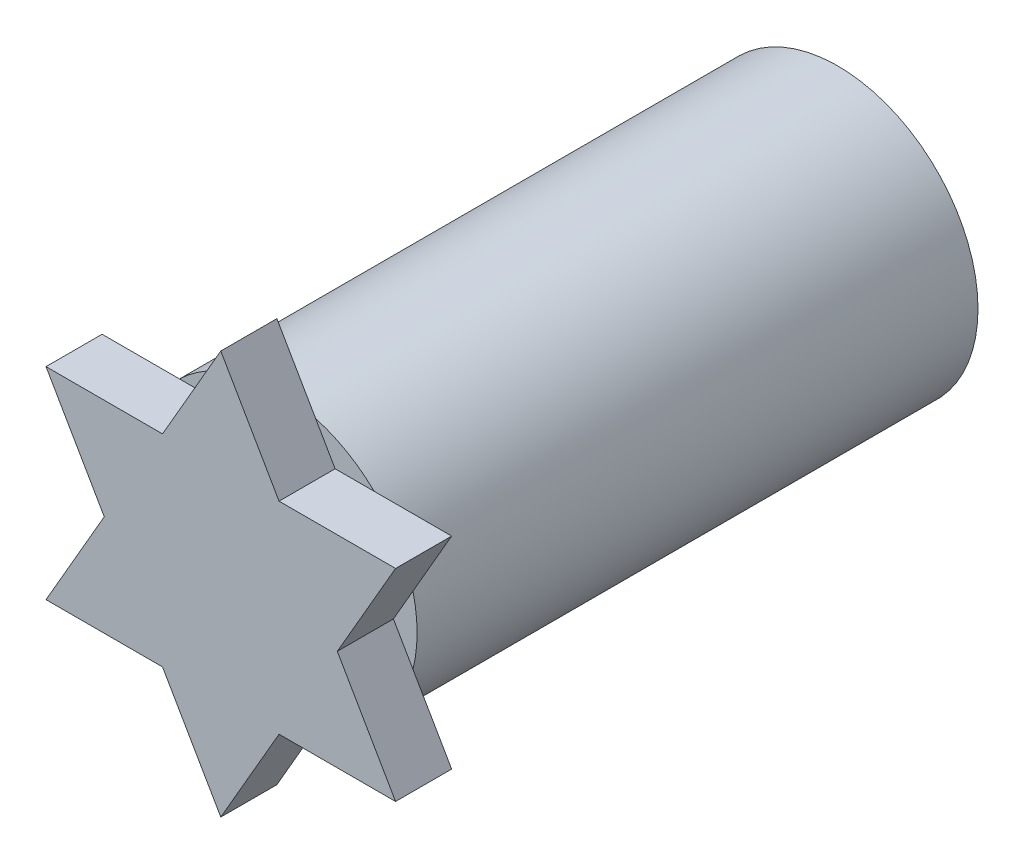
ISO-10303-21;
HEADER;
FILE_DESCRIPTION(('STEP AP214'),'2;1');
FILE_NAME('part.step','',(''),(''),'','','');
FILE_SCHEMA(('AUTOMOTIVE_DESIGN { 1 0 10303 214 1 1 1 1 }'));
ENDSEC;
DATA;
#1=APPLICATION_CONTEXT('core data for automotive mechanical design processes');
#2=APPLICATION_PROTOCOL_DEFINITION('international standard','automotive_design',2000,#1);
#3=PRODUCT_CONTEXT('',#1,'mechanical');
#4=PRODUCT('Part','Part','',(#3));
#5=PRODUCT_RELATED_PRODUCT_CATEGORY('part','',(#4));
#6=PRODUCT_DEFINITION_FORMATION('','',#4);
#7=PRODUCT_DEFINITION_CONTEXT('part definition',#1,'design');
#8=PRODUCT_DEFINITION('design','',#6,#7);
#9=PRODUCT_DEFINITION_SHAPE('','',#8);
#10=(LENGTH_UNIT() NAMED_UNIT(*) SI_UNIT(.MILLI.,.METRE.));
#11=(NAMED_UNIT(*) PLANE_ANGLE_UNIT() SI_UNIT($,.RADIAN.));
#12=(NAMED_UNIT(*) SI_UNIT($,.STERADIAN.) SOLID_ANGLE_UNIT());
#13=UNCERTAINTY_MEASURE_WITH_UNIT(LENGTH_MEASURE(1.E-05),#10,'distance_accuracy_value','');
#14=(GEOMETRIC_REPRESENTATION_CONTEXT(3) GLOBAL_UNCERTAINTY_ASSIGNED_CONTEXT((#13)) GLOBAL_UNIT_ASSIGNED_CONTEXT((#10,
#11,#12)) REPRESENTATION_CONTEXT('',''));
#15=CARTESIAN_POINT('',(0.,0.,0.));
#16=DIRECTION('',(0.,0.,1.));
#17=DIRECTION('',(1.,0.,0.));
#18=AXIS2_PLACEMENT_3D('',#15,#16,#17);
#19=CARTESIAN_POINT('',(0.,0.,10.));
#20=DIRECTION('',(0.,0.,1.));
#21=DIRECTION('',(1.,0.,0.));
#22=AXIS2_PLACEMENT_3D('',#19,#20,#21);
#23=PLANE('',#22);
#24=DIRECTION('',(-1.,0.,0.));
#25=VECTOR('',#24,1.);
#26=CARTESIAN_POINT('',(0.,1.799083866182,10.));
#27=LINE('',#26,#25);
#28=CARTESIAN_POINT('',(-1.03870155443489,1.799083866182,10.));
#29=VERTEX_POINT('',#28);
#30=CARTESIAN_POINT('',(-1.73588514667406,1.799083866182,10.));
#31=VERTEX_POINT('',#30);
#32=EDGE_CURVE('E60',#29,#31,#27,.T.);
#33=ORIENTED_EDGE('',*,*,#32,.F.);
#34=DIRECTION('',(-0.5,-0.866025403784439,0.));
#35=VECTOR('',#34,1.);
#36=CARTESIAN_POINT('',(-1.55805233165234,0.899541933091002,10.));
#37=LINE('',#36,#35);
#38=CARTESIAN_POINT('',(-0.690109758315309,2.40286256816281,10.));
#39=VERTEX_POINT('',#38);
#40=EDGE_CURVE('E11',#39,#29,#37,.T.);
#41=ORIENTED_EDGE('',*,*,#40,.F.);
#42=CARTESIAN_POINT('',(0.,0.,10.));
#43=DIRECTION('',(0.,0.,1.));
#44=DIRECTION('',(1.,0.,0.));
#45=AXIS2_PLACEMENT_3D('',#42,#43,#44);
#46=CIRCLE('',#45,2.5);
#47=EDGE_CURVE('E266',#39,#31,#46,.T.);
#48=ORIENTED_EDGE('',*,*,#47,.T.);
#49=EDGE_LOOP('',(#33,#41,#48));
#50=FACE_BOUND('',#49,.T.);
#51=ADVANCED_FACE('F41',(#50),#23,.T.);
#52=DIRECTION('',(-0.5,0.866025403784438,0.));
#53=VECTOR('',#52,1.);
#54=CARTESIAN_POINT('',(1.55805233165234,0.899541933091003,10.));
#55=LINE('',#54,#53);
#56=CARTESIAN_POINT('',(1.03870155443489,1.799083866182,10.));
#57=VERTEX_POINT('',#56);
#58=CARTESIAN_POINT('',(0.69010975831531,2.40286256816281,10.));
#59=VERTEX_POINT('',#58);
#60=EDGE_CURVE('E67',#57,#59,#55,.T.);
#61=ORIENTED_EDGE('',*,*,#60,.F.);
#62=DIRECTION('',(-1.,0.,0.));
#63=VECTOR('',#62,1.);
#64=CARTESIAN_POINT('',(0.,1.799083866182,10.));
#65=LINE('',#64,#63);
#66=CARTESIAN_POINT('',(1.73588514667406,1.799083866182,10.));
#67=VERTEX_POINT('',#66);
#68=EDGE_CURVE('E51',#67,#57,#65,.T.);
#69=ORIENTED_EDGE('',*,*,#68,.F.);
#70=EDGE_CURVE('E212',#67,#59,#46,.T.);
#71=ORIENTED_EDGE('',*,*,#70,.T.);
#72=EDGE_LOOP('',(#61,#69,#71));
#73=FACE_BOUND('',#72,.T.);
#74=ADVANCED_FACE('F401',(#73),#23,.T.);
#75=DIRECTION('',(0.5,0.866025403784439,0.));
#76=VECTOR('',#75,1.);
#77=CARTESIAN_POINT('',(1.55805233165234,-0.899541933091001,10.));
#78=LINE('',#77,#76);
#79=CARTESIAN_POINT('',(2.07740310886979,0.,10.));
#80=VERTEX_POINT('',#79);
#81=CARTESIAN_POINT('',(2.42599490498937,0.603778701980809,10.));
#82=VERTEX_POINT('',#81);
#83=EDGE_CURVE('E378',#80,#82,#78,.T.);
#84=ORIENTED_EDGE('',*,*,#83,.F.);
#85=DIRECTION('',(-0.5,0.866025403784438,0.));
#86=VECTOR('',#85,1.);
#87=CARTESIAN_POINT('',(1.55805233165234,0.899541933091003,10.));
#88=LINE('',#87,#86);
#89=CARTESIAN_POINT('',(2.42599490498937,-0.603778701980807,10.));
#90=VERTEX_POINT('',#89);
#91=EDGE_CURVE('E349',#90,#80,#88,.T.);
#92=ORIENTED_EDGE('',*,*,#91,.F.);
#93=EDGE_CURVE('E204',#90,#82,#46,.T.);
#94=ORIENTED_EDGE('',*,*,#93,.T.);
#95=EDGE_LOOP('',(#84,#92,#94));
#96=FACE_BOUND('',#95,.T.);
#97=ADVANCED_FACE('F394',(#96),#23,.T.);
#98=DIRECTION('',(1.,0.,0.));
#99=VECTOR('',#98,1.);
#100=CARTESIAN_POINT('',(0.,-1.799083866182,10.));
#101=LINE('',#100,#99);
#102=CARTESIAN_POINT('',(1.03870155443489,-1.799083866182,10.));
#103=VERTEX_POINT('',#102);
#104=CARTESIAN_POINT('',(1.73588514667406,-1.799083866182,10.));
#105=VERTEX_POINT('',#104);
#106=EDGE_CURVE('E363',#103,#105,#101,.T.);
#107=ORIENTED_EDGE('',*,*,#106,.F.);
#108=DIRECTION('',(0.5,0.866025403784439,0.));
#109=VECTOR('',#108,1.);
#110=CARTESIAN_POINT('',(1.55805233165234,-0.899541933091001,10.));
#111=LINE('',#110,#109);
#112=CARTESIAN_POINT('',(0.69010975831531,-2.40286256816281,10.));
#113=VERTEX_POINT('',#112);
#114=EDGE_CURVE('E346',#113,#103,#111,.T.);
#115=ORIENTED_EDGE('',*,*,#114,.F.);
#116=EDGE_CURVE('E230',#113,#105,#46,.T.);
#117=ORIENTED_EDGE('',*,*,#116,.T.);
#118=EDGE_LOOP('',(#107,#115,#117));
#119=FACE_BOUND('',#118,.T.);
#120=ADVANCED_FACE('F392',(#119),#23,.T.);
#121=DIRECTION('',(0.5,-0.866025403784439,0.));
#122=VECTOR('',#121,1.);
#123=CARTESIAN_POINT('',(-1.55805233165234,-0.899541933091001,10.));
#124=LINE('',#123,#122);
#125=CARTESIAN_POINT('',(-1.03870155443489,-1.799083866182,10.));
#126=VERTEX_POINT('',#125);
#127=CARTESIAN_POINT('',(-0.69010975831531,-2.40286256816281,10.));
#128=VERTEX_POINT('',#127);
#129=EDGE_CURVE('E342',#126,#128,#124,.T.);
#130=ORIENTED_EDGE('',*,*,#129,.F.);
#131=DIRECTION('',(1.,0.,0.));
#132=VECTOR('',#131,1.);
#133=CARTESIAN_POINT('',(0.,-1.799083866182,10.));
#134=LINE('',#133,#132);
#135=CARTESIAN_POINT('',(-1.73588514667406,-1.799083866182,10.));
#136=VERTEX_POINT('',#135);
#137=EDGE_CURVE('E220',#136,#126,#134,.T.);
#138=ORIENTED_EDGE('',*,*,#137,.F.);
#139=EDGE_CURVE('E242',#136,#128,#46,.T.);
#140=ORIENTED_EDGE('',*,*,#139,.T.);
#141=EDGE_LOOP('',(#130,#138,#140));
#142=FACE_BOUND('',#141,.T.);
#143=ADVANCED_FACE('F369',(#142),#23,.T.);
#144=CARTESIAN_POINT('',(0.,0.,10.));
#145=DIRECTION('',(0.,0.,-1.));
#146=DIRECTION('',(-1.,0.,0.));
#147=AXIS2_PLACEMENT_3D('',#144,#145,#146);
#148=CYLINDRICAL_SURFACE('',#147,2.5);
#149=EDGE_CURVE('E208',#82,#67,#46,.T.);
#150=ORIENTED_EDGE('',*,*,#149,.F.);
#151=ORIENTED_EDGE('',*,*,#93,.F.);
#152=EDGE_CURVE('E225',#105,#90,#46,.T.);
#153=ORIENTED_EDGE('',*,*,#152,.F.);
#154=ORIENTED_EDGE('',*,*,#116,.F.);
#155=EDGE_CURVE('E237',#128,#113,#46,.T.);
#156=ORIENTED_EDGE('',*,*,#155,.F.);
#157=ORIENTED_EDGE('',*,*,#139,.F.);
#158=CARTESIAN_POINT('',(-2.42599490498937,-0.603778701980808,10.));
#159=VERTEX_POINT('',#158);
#160=EDGE_CURVE('E249',#159,#136,#46,.T.);
#161=ORIENTED_EDGE('',*,*,#160,.F.);
#162=CARTESIAN_POINT('',(-2.42599490498937,0.603778701980809,10.));
#163=VERTEX_POINT('',#162);
#164=EDGE_CURVE('E254',#163,#159,#46,.T.);
#165=ORIENTED_EDGE('',*,*,#164,.F.);
#166=EDGE_CURVE('E261',#31,#163,#46,.T.);
#167=ORIENTED_EDGE('',*,*,#166,.F.);
#168=ORIENTED_EDGE('',*,*,#47,.F.);
#169=EDGE_CURVE('E223',#59,#39,#46,.T.);
#170=ORIENTED_EDGE('',*,*,#169,.F.);
#171=ORIENTED_EDGE('',*,*,#70,.F.);
#172=EDGE_LOOP('',(#150,#151,#153,#154,#156,#157,#161,#165,#167,#168,#170,#171));
#173=FACE_BOUND('',#172,.T.);
#174=CARTESIAN_POINT('',(0.,0.,0.));
#175=DIRECTION('',(0.,0.,1.));
#176=DIRECTION('',(1.,0.,0.));
#177=AXIS2_PLACEMENT_3D('',#174,#175,#176);
#178=CIRCLE('',#177,2.5);
#179=CARTESIAN_POINT('',(2.5,0.,0.));
#180=VERTEX_POINT('',#179);
#181=EDGE_CURVE('E45',#180,#180,#178,.T.);
#182=ORIENTED_EDGE('',*,*,#181,.T.);
#183=EDGE_LOOP('',(#182));
#184=FACE_BOUND('',#183,.T.);
#185=ADVANCED_FACE('F43',(#173,#184),#148,.T.);
#186=DIRECTION('',(-0.5,-0.866025403784439,0.));
#187=VECTOR('',#186,1.);
#188=CARTESIAN_POINT('',(-1.55805233165234,0.899541933091002,10.));
#189=LINE('',#188,#187);
#190=CARTESIAN_POINT('',(-2.07740310886978,0.,10.));
#191=VERTEX_POINT('',#190);
#192=EDGE_CURVE('E338',#191,#159,#189,.T.);
#193=ORIENTED_EDGE('',*,*,#192,.F.);
#194=DIRECTION('',(0.5,-0.866025403784439,0.));
#195=VECTOR('',#194,1.);
#196=CARTESIAN_POINT('',(-1.55805233165234,-0.899541933091001,10.));
#197=LINE('',#196,#195);
#198=EDGE_CURVE('E211',#163,#191,#197,.T.);
#199=ORIENTED_EDGE('',*,*,#198,.F.);
#200=ORIENTED_EDGE('',*,*,#164,.T.);
#201=EDGE_LOOP('',(#193,#199,#200));
#202=FACE_BOUND('',#201,.T.);
#203=ADVANCED_FACE('F400',(#202),#23,.T.);
#204=CARTESIAN_POINT('',(0.,0.,0.));
#205=DIRECTION('',(0.,0.,1.));
#206=DIRECTION('',(1.,0.,0.));
#207=AXIS2_PLACEMENT_3D('',#204,#205,#206);
#208=PLANE('',#207);
#209=ORIENTED_EDGE('',*,*,#181,.F.);
#210=EDGE_LOOP('',(#209));
#211=FACE_BOUND('',#210,.T.);
#212=ADVANCED_FACE('F408',(#211),#208,.F.);
#213=CARTESIAN_POINT('',(0.,0.,10.));
#214=DIRECTION('',(0.,0.,1.));
#215=DIRECTION('',(1.,0.,0.));
#216=AXIS2_PLACEMENT_3D('',#213,#214,#215);
#217=PLANE('',#216);
#218=CARTESIAN_POINT('',(3.11610466330468,1.799083866182,10.));
#219=VERTEX_POINT('',#218);
#220=EDGE_CURVE('E371',#82,#219,#78,.T.);
#221=ORIENTED_EDGE('',*,*,#220,.F.);
#222=ORIENTED_EDGE('',*,*,#149,.T.);
#223=EDGE_CURVE('E374',#219,#67,#65,.T.);
#224=ORIENTED_EDGE('',*,*,#223,.F.);
#225=EDGE_LOOP('',(#221,#222,#224));
#226=FACE_BOUND('',#225,.T.);
#227=ADVANCED_FACE('F373',(#226),#217,.F.);
#228=CARTESIAN_POINT('',(0.,3.598167732364,10.));
#229=VERTEX_POINT('',#228);
#230=EDGE_CURVE('E277',#59,#229,#55,.T.);
#231=ORIENTED_EDGE('',*,*,#230,.F.);
#232=ORIENTED_EDGE('',*,*,#169,.T.);
#233=EDGE_CURVE('E53',#229,#39,#37,.T.);
#234=ORIENTED_EDGE('',*,*,#233,.F.);
#235=EDGE_LOOP('',(#231,#232,#234));
#236=FACE_BOUND('',#235,.T.);
#237=ADVANCED_FACE('F276',(#236),#217,.F.);
#238=CARTESIAN_POINT('',(-3.11610466330468,1.799083866182,10.));
#239=VERTEX_POINT('',#238);
#240=EDGE_CURVE('E197',#31,#239,#27,.T.);
#241=ORIENTED_EDGE('',*,*,#240,.F.);
#242=ORIENTED_EDGE('',*,*,#166,.T.);
#243=EDGE_CURVE('E222',#239,#163,#197,.T.);
#244=ORIENTED_EDGE('',*,*,#243,.F.);
#245=EDGE_LOOP('',(#241,#242,#244));
#246=FACE_BOUND('',#245,.T.);
#247=ADVANCED_FACE('F473',(#246),#217,.F.);
#248=CARTESIAN_POINT('',(-3.11610466330468,-1.79908386618201,10.));
#249=VERTEX_POINT('',#248);
#250=EDGE_CURVE('E334',#159,#249,#189,.T.);
#251=ORIENTED_EDGE('',*,*,#250,.F.);
#252=ORIENTED_EDGE('',*,*,#160,.T.);
#253=EDGE_CURVE('E329',#249,#136,#134,.T.);
#254=ORIENTED_EDGE('',*,*,#253,.F.);
#255=EDGE_LOOP('',(#251,#252,#254));
#256=FACE_BOUND('',#255,.T.);
#257=ADVANCED_FACE('F333',(#256),#217,.F.);
#258=CARTESIAN_POINT('',(0.,-3.59816773236401,10.));
#259=VERTEX_POINT('',#258);
#260=EDGE_CURVE('E337',#128,#259,#124,.T.);
#261=ORIENTED_EDGE('',*,*,#260,.F.);
#262=ORIENTED_EDGE('',*,*,#155,.T.);
#263=EDGE_CURVE('E351',#259,#113,#111,.T.);
#264=ORIENTED_EDGE('',*,*,#263,.F.);
#265=EDGE_LOOP('',(#261,#262,#264));
#266=FACE_BOUND('',#265,.T.);
#267=ADVANCED_FACE('F461',(#266),#217,.F.);
#268=CARTESIAN_POINT('',(3.11610466330468,-1.799083866182,10.));
#269=VERTEX_POINT('',#268);
#270=EDGE_CURVE('E360',#105,#269,#101,.T.);
#271=ORIENTED_EDGE('',*,*,#270,.F.);
#272=ORIENTED_EDGE('',*,*,#152,.T.);
#273=EDGE_CURVE('E357',#269,#90,#88,.T.);
#274=ORIENTED_EDGE('',*,*,#273,.F.);
#275=EDGE_LOOP('',(#271,#272,#274));
#276=FACE_BOUND('',#275,.T.);
#277=ADVANCED_FACE('F459',(#276),#217,.F.);
#278=CARTESIAN_POINT('',(0.,1.799083866182,11.));
#279=DIRECTION('',(0.,-1.,0.));
#280=DIRECTION('',(1.,0.,0.));
#281=AXIS2_PLACEMENT_3D('',#278,#279,#280);
#282=PLANE('',#281);
#283=ORIENTED_EDGE('',*,*,#32,.T.);
#284=ORIENTED_EDGE('',*,*,#240,.T.);
#285=DIRECTION('',(0.,0.,-1.));
#286=VECTOR('',#285,1.);
#287=CARTESIAN_POINT('',(-3.11610466330468,1.799083866182,11.));
#288=LINE('',#287,#286);
#289=CARTESIAN_POINT('',(-3.11610466330468,1.799083866182,11.));
#290=VERTEX_POINT('',#289);
#291=EDGE_CURVE('E176',#290,#239,#288,.T.);
#292=ORIENTED_EDGE('',*,*,#291,.F.);
#293=DIRECTION('',(-1.,0.,0.));
#294=VECTOR('',#293,1.);
#295=CARTESIAN_POINT('',(0.,1.799083866182,11.));
#296=LINE('',#295,#294);
#297=CARTESIAN_POINT('',(-1.03870155443489,1.799083866182,11.));
#298=VERTEX_POINT('',#297);
#299=EDGE_CURVE('E184',#298,#290,#296,.T.);
#300=ORIENTED_EDGE('',*,*,#299,.F.);
#301=DIRECTION('',(0.,0.,-1.));
#302=VECTOR('',#301,1.);
#303=CARTESIAN_POINT('',(-1.03870155443489,1.799083866182,11.));
#304=LINE('',#303,#302);
#305=EDGE_CURVE('E290',#298,#29,#304,.T.);
#306=ORIENTED_EDGE('',*,*,#305,.T.);
#307=EDGE_LOOP('',(#283,#284,#292,#300,#306));
#308=FACE_BOUND('',#307,.T.);
#309=ADVANCED_FACE('F195',(#308),#282,.F.);
#310=CARTESIAN_POINT('',(-1.55805233165234,-0.899541933091001,11.));
#311=DIRECTION('',(0.866025403784439,0.5,0.));
#312=DIRECTION('',(-0.5,0.866025403784439,0.));
#313=AXIS2_PLACEMENT_3D('',#310,#311,#312);
#314=PLANE('',#313);
#315=ORIENTED_EDGE('',*,*,#243,.T.);
#316=ORIENTED_EDGE('',*,*,#198,.T.);
#317=DIRECTION('',(0.,0.,-1.));
#318=VECTOR('',#317,1.);
#319=CARTESIAN_POINT('',(-2.07740310886978,0.,11.));
#320=LINE('',#319,#318);
#321=CARTESIAN_POINT('',(-2.07740310886978,0.,11.));
#322=VERTEX_POINT('',#321);
#323=EDGE_CURVE('E179',#322,#191,#320,.T.);
#324=ORIENTED_EDGE('',*,*,#323,.F.);
#325=DIRECTION('',(0.5,-0.866025403784439,0.));
#326=VECTOR('',#325,1.);
#327=CARTESIAN_POINT('',(-1.55805233165234,-0.899541933091001,11.));
#328=LINE('',#327,#326);
#329=EDGE_CURVE('E171',#290,#322,#328,.T.);
#330=ORIENTED_EDGE('',*,*,#329,.F.);
#331=ORIENTED_EDGE('',*,*,#291,.T.);
#332=EDGE_LOOP('',(#315,#316,#324,#330,#331));
#333=FACE_BOUND('',#332,.T.);
#334=ADVANCED_FACE('F174',(#333),#314,.F.);
#335=CARTESIAN_POINT('',(-1.55805233165234,0.899541933091002,11.));
#336=DIRECTION('',(0.866025403784439,-0.5,0.));
#337=DIRECTION('',(0.5,0.866025403784439,0.));
#338=AXIS2_PLACEMENT_3D('',#335,#336,#337);
#339=PLANE('',#338);
#340=ORIENTED_EDGE('',*,*,#192,.T.);
#341=ORIENTED_EDGE('',*,*,#250,.T.);
#342=DIRECTION('',(0.,0.,-1.));
#343=VECTOR('',#342,1.);
#344=CARTESIAN_POINT('',(-3.11610466330468,-1.79908386618201,11.));
#345=LINE('',#344,#343);
#346=CARTESIAN_POINT('',(-3.11610466330468,-1.79908386618201,11.));
#347=VERTEX_POINT('',#346);
#348=EDGE_CURVE('E205',#347,#249,#345,.T.);
#349=ORIENTED_EDGE('',*,*,#348,.F.);
#350=DIRECTION('',(-0.5,-0.866025403784439,0.));
#351=VECTOR('',#350,1.);
#352=CARTESIAN_POINT('',(-1.55805233165234,0.899541933091002,11.));
#353=LINE('',#352,#351);
#354=EDGE_CURVE('E183',#322,#347,#353,.T.);
#355=ORIENTED_EDGE('',*,*,#354,.F.);
#356=ORIENTED_EDGE('',*,*,#323,.T.);
#357=EDGE_LOOP('',(#340,#341,#349,#355,#356));
#358=FACE_BOUND('',#357,.T.);
#359=ADVANCED_FACE('F414',(#358),#339,.F.);
#360=CARTESIAN_POINT('',(0.,-1.799083866182,11.));
#361=DIRECTION('',(0.,1.,0.));
#362=DIRECTION('',(-1.,0.,0.));
#363=AXIS2_PLACEMENT_3D('',#360,#361,#362);
#364=PLANE('',#363);
#365=ORIENTED_EDGE('',*,*,#253,.T.);
#366=ORIENTED_EDGE('',*,*,#137,.T.);
#367=DIRECTION('',(0.,0.,-1.));
#368=VECTOR('',#367,1.);
#369=CARTESIAN_POINT('',(-1.03870155443489,-1.799083866182,11.));
#370=LINE('',#369,#368);
#371=CARTESIAN_POINT('',(-1.03870155443489,-1.799083866182,11.));
#372=VERTEX_POINT('',#371);
#373=EDGE_CURVE('E319',#372,#126,#370,.T.);
#374=ORIENTED_EDGE('',*,*,#373,.F.);
#375=DIRECTION('',(1.,0.,0.));
#376=VECTOR('',#375,1.);
#377=CARTESIAN_POINT('',(0.,-1.799083866182,11.));
#378=LINE('',#377,#376);
#379=EDGE_CURVE('E331',#347,#372,#378,.T.);
#380=ORIENTED_EDGE('',*,*,#379,.F.);
#381=ORIENTED_EDGE('',*,*,#348,.T.);
#382=EDGE_LOOP('',(#365,#366,#374,#380,#381));
#383=FACE_BOUND('',#382,.T.);
#384=ADVANCED_FACE('F327',(#383),#364,.F.);
#385=CARTESIAN_POINT('',(-1.55805233165234,-0.899541933091001,11.));
#386=DIRECTION('',(0.866025403784439,0.5,0.));
#387=DIRECTION('',(-0.5,0.866025403784439,0.));
#388=AXIS2_PLACEMENT_3D('',#385,#386,#387);
#389=PLANE('',#388);
#390=ORIENTED_EDGE('',*,*,#129,.T.);
#391=ORIENTED_EDGE('',*,*,#260,.T.);
#392=DIRECTION('',(0.,0.,-1.));
#393=VECTOR('',#392,1.);
#394=CARTESIAN_POINT('',(0.,-3.59816773236401,11.));
#395=LINE('',#394,#393);
#396=CARTESIAN_POINT('',(0.,-3.59816773236401,11.));
#397=VERTEX_POINT('',#396);
#398=EDGE_CURVE('E315',#397,#259,#395,.T.);
#399=ORIENTED_EDGE('',*,*,#398,.F.);
#400=DIRECTION('',(0.5,-0.866025403784439,0.));
#401=VECTOR('',#400,1.);
#402=CARTESIAN_POINT('',(-1.55805233165234,-0.899541933091001,11.));
#403=LINE('',#402,#401);
#404=EDGE_CURVE('E418',#372,#397,#403,.T.);
#405=ORIENTED_EDGE('',*,*,#404,.F.);
#406=ORIENTED_EDGE('',*,*,#373,.T.);
#407=EDGE_LOOP('',(#390,#391,#399,#405,#406));
#408=FACE_BOUND('',#407,.T.);
#409=ADVANCED_FACE('F366',(#408),#389,.F.);
#410=CARTESIAN_POINT('',(1.55805233165234,-0.899541933091001,11.));
#411=DIRECTION('',(-0.866025403784439,0.5,0.));
#412=DIRECTION('',(-0.5,-0.866025403784439,0.));
#413=AXIS2_PLACEMENT_3D('',#410,#411,#412);
#414=PLANE('',#413);
#415=ORIENTED_EDGE('',*,*,#263,.T.);
#416=ORIENTED_EDGE('',*,*,#114,.T.);
#417=DIRECTION('',(0.,0.,-1.));
#418=VECTOR('',#417,1.);
#419=CARTESIAN_POINT('',(1.03870155443489,-1.799083866182,11.));
#420=LINE('',#419,#418);
#421=CARTESIAN_POINT('',(1.03870155443489,-1.799083866182,11.));
#422=VERTEX_POINT('',#421);
#423=EDGE_CURVE('E311',#422,#103,#420,.T.);
#424=ORIENTED_EDGE('',*,*,#423,.F.);
#425=DIRECTION('',(0.5,0.866025403784439,0.));
#426=VECTOR('',#425,1.);
#427=CARTESIAN_POINT('',(1.55805233165234,-0.899541933091001,11.));
#428=LINE('',#427,#426);
#429=EDGE_CURVE('E423',#397,#422,#428,.T.);
#430=ORIENTED_EDGE('',*,*,#429,.F.);
#431=ORIENTED_EDGE('',*,*,#398,.T.);
#432=EDGE_LOOP('',(#415,#416,#424,#430,#431));
#433=FACE_BOUND('',#432,.T.);
#434=ADVANCED_FACE('F532',(#433),#414,.F.);
#435=CARTESIAN_POINT('',(0.,-1.799083866182,11.));
#436=DIRECTION('',(0.,1.,0.));
#437=DIRECTION('',(-1.,0.,0.));
#438=AXIS2_PLACEMENT_3D('',#435,#436,#437);
#439=PLANE('',#438);
#440=ORIENTED_EDGE('',*,*,#106,.T.);
#441=ORIENTED_EDGE('',*,*,#270,.T.);
#442=DIRECTION('',(0.,0.,-1.));
#443=VECTOR('',#442,1.);
#444=CARTESIAN_POINT('',(3.11610466330468,-1.799083866182,11.));
#445=LINE('',#444,#443);
#446=CARTESIAN_POINT('',(3.11610466330468,-1.799083866182,11.));
#447=VERTEX_POINT('',#446);
#448=EDGE_CURVE('E307',#447,#269,#445,.T.);
#449=ORIENTED_EDGE('',*,*,#448,.F.);
#450=DIRECTION('',(1.,0.,0.));
#451=VECTOR('',#450,1.);
#452=CARTESIAN_POINT('',(0.,-1.799083866182,11.));
#453=LINE('',#452,#451);
#454=EDGE_CURVE('E426',#422,#447,#453,.T.);
#455=ORIENTED_EDGE('',*,*,#454,.F.);
#456=ORIENTED_EDGE('',*,*,#423,.T.);
#457=EDGE_LOOP('',(#440,#441,#449,#455,#456));
#458=FACE_BOUND('',#457,.T.);
#459=ADVANCED_FACE('F389',(#458),#439,.F.);
#460=CARTESIAN_POINT('',(1.55805233165234,0.899541933091003,11.));
#461=DIRECTION('',(-0.866025403784438,-0.5,0.));
#462=DIRECTION('',(0.5,-0.866025403784438,0.));
#463=AXIS2_PLACEMENT_3D('',#460,#461,#462);
#464=PLANE('',#463);
#465=ORIENTED_EDGE('',*,*,#273,.T.);
#466=ORIENTED_EDGE('',*,*,#91,.T.);
#467=DIRECTION('',(0.,0.,-1.));
#468=VECTOR('',#467,1.);
#469=CARTESIAN_POINT('',(2.07740310886979,0.,11.));
#470=LINE('',#469,#468);
#471=CARTESIAN_POINT('',(2.07740310886979,0.,11.));
#472=VERTEX_POINT('',#471);
#473=EDGE_CURVE('E303',#472,#80,#470,.T.);
#474=ORIENTED_EDGE('',*,*,#473,.F.);
#475=DIRECTION('',(-0.5,0.866025403784438,0.));
#476=VECTOR('',#475,1.);
#477=CARTESIAN_POINT('',(1.55805233165234,0.899541933091003,11.));
#478=LINE('',#477,#476);
#479=EDGE_CURVE('E429',#447,#472,#478,.T.);
#480=ORIENTED_EDGE('',*,*,#479,.F.);
#481=ORIENTED_EDGE('',*,*,#448,.T.);
#482=EDGE_LOOP('',(#465,#466,#474,#480,#481));
#483=FACE_BOUND('',#482,.T.);
#484=ADVANCED_FACE('F458',(#483),#464,.F.);
#485=CARTESIAN_POINT('',(1.55805233165234,-0.899541933091001,11.));
#486=DIRECTION('',(-0.866025403784439,0.5,0.));
#487=DIRECTION('',(-0.5,-0.866025403784439,0.));
#488=AXIS2_PLACEMENT_3D('',#485,#486,#487);
#489=PLANE('',#488);
#490=ORIENTED_EDGE('',*,*,#83,.T.);
#491=ORIENTED_EDGE('',*,*,#220,.T.);
#492=DIRECTION('',(0.,0.,-1.));
#493=VECTOR('',#492,1.);
#494=CARTESIAN_POINT('',(3.11610466330468,1.799083866182,11.));
#495=LINE('',#494,#493);
#496=CARTESIAN_POINT('',(3.11610466330468,1.799083866182,11.));
#497=VERTEX_POINT('',#496);
#498=EDGE_CURVE('E299',#497,#219,#495,.T.);
#499=ORIENTED_EDGE('',*,*,#498,.F.);
#500=DIRECTION('',(0.5,0.866025403784439,0.));
#501=VECTOR('',#500,1.);
#502=CARTESIAN_POINT('',(1.55805233165234,-0.899541933091001,11.));
#503=LINE('',#502,#501);
#504=EDGE_CURVE('E432',#472,#497,#503,.T.);
#505=ORIENTED_EDGE('',*,*,#504,.F.);
#506=ORIENTED_EDGE('',*,*,#473,.T.);
#507=EDGE_LOOP('',(#490,#491,#499,#505,#506));
#508=FACE_BOUND('',#507,.T.);
#509=ADVANCED_FACE('F380',(#508),#489,.F.);
#510=CARTESIAN_POINT('',(0.,1.799083866182,11.));
#511=DIRECTION('',(0.,-1.,0.));
#512=DIRECTION('',(1.,0.,0.));
#513=AXIS2_PLACEMENT_3D('',#510,#511,#512);
#514=PLANE('',#513);
#515=ORIENTED_EDGE('',*,*,#223,.T.);
#516=ORIENTED_EDGE('',*,*,#68,.T.);
#517=DIRECTION('',(0.,0.,-1.));
#518=VECTOR('',#517,1.);
#519=CARTESIAN_POINT('',(1.03870155443489,1.799083866182,11.));
#520=LINE('',#519,#518);
#521=CARTESIAN_POINT('',(1.03870155443489,1.799083866182,11.));
#522=VERTEX_POINT('',#521);
#523=EDGE_CURVE('E295',#522,#57,#520,.T.);
#524=ORIENTED_EDGE('',*,*,#523,.F.);
#525=DIRECTION('',(-1.,0.,0.));
#526=VECTOR('',#525,1.);
#527=CARTESIAN_POINT('',(0.,1.799083866182,11.));
#528=LINE('',#527,#526);
#529=EDGE_CURVE('E435',#497,#522,#528,.T.);
#530=ORIENTED_EDGE('',*,*,#529,.F.);
#531=ORIENTED_EDGE('',*,*,#498,.T.);
#532=EDGE_LOOP('',(#515,#516,#524,#530,#531));
#533=FACE_BOUND('',#532,.T.);
#534=ADVANCED_FACE('F454',(#533),#514,.F.);
#535=CARTESIAN_POINT('',(1.55805233165234,0.899541933091003,11.));
#536=DIRECTION('',(-0.866025403784438,-0.5,0.));
#537=DIRECTION('',(0.5,-0.866025403784438,0.));
#538=AXIS2_PLACEMENT_3D('',#535,#536,#537);
#539=PLANE('',#538);
#540=ORIENTED_EDGE('',*,*,#60,.T.);
#541=ORIENTED_EDGE('',*,*,#230,.T.);
#542=DIRECTION('',(0.,0.,-1.));
#543=VECTOR('',#542,1.);
#544=CARTESIAN_POINT('',(0.,3.598167732364,11.));
#545=LINE('',#544,#543);
#546=CARTESIAN_POINT('',(0.,3.598167732364,11.));
#547=VERTEX_POINT('',#546);
#548=EDGE_CURVE('E284',#547,#229,#545,.T.);
#549=ORIENTED_EDGE('',*,*,#548,.F.);
#550=DIRECTION('',(-0.5,0.866025403784438,0.));
#551=VECTOR('',#550,1.);
#552=CARTESIAN_POINT('',(1.55805233165234,0.899541933091003,11.));
#553=LINE('',#552,#551);
#554=EDGE_CURVE('E438',#522,#547,#553,.T.);
#555=ORIENTED_EDGE('',*,*,#554,.F.);
#556=ORIENTED_EDGE('',*,*,#523,.T.);
#557=EDGE_LOOP('',(#540,#541,#549,#555,#556));
#558=FACE_BOUND('',#557,.T.);
#559=ADVANCED_FACE('F451',(#558),#539,.F.);
#560=CARTESIAN_POINT('',(-1.55805233165234,0.899541933091002,11.));
#561=DIRECTION('',(0.866025403784439,-0.5,0.));
#562=DIRECTION('',(0.5,0.866025403784439,0.));
#563=AXIS2_PLACEMENT_3D('',#560,#561,#562);
#564=PLANE('',#563);
#565=ORIENTED_EDGE('',*,*,#233,.T.);
#566=ORIENTED_EDGE('',*,*,#40,.T.);
#567=ORIENTED_EDGE('',*,*,#305,.F.);
#568=DIRECTION('',(-0.5,-0.866025403784439,0.));
#569=VECTOR('',#568,1.);
#570=CARTESIAN_POINT('',(-1.55805233165234,0.899541933091002,11.));
#571=LINE('',#570,#569);
#572=EDGE_CURVE('E189',#547,#298,#571,.T.);
#573=ORIENTED_EDGE('',*,*,#572,.F.);
#574=ORIENTED_EDGE('',*,*,#548,.T.);
#575=EDGE_LOOP('',(#565,#566,#567,#573,#574));
#576=FACE_BOUND('',#575,.T.);
#577=ADVANCED_FACE('F282',(#576),#564,.F.);
#578=CARTESIAN_POINT('',(0.,0.,11.));
#579=DIRECTION('',(0.,0.,1.));
#580=DIRECTION('',(1.,0.,0.));
#581=AXIS2_PLACEMENT_3D('',#578,#579,#580);
#582=PLANE('',#581);
#583=ORIENTED_EDGE('',*,*,#299,.T.);
#584=ORIENTED_EDGE('',*,*,#329,.T.);
#585=ORIENTED_EDGE('',*,*,#354,.T.);
#586=ORIENTED_EDGE('',*,*,#379,.T.);
#587=ORIENTED_EDGE('',*,*,#404,.T.);
#588=ORIENTED_EDGE('',*,*,#429,.T.);
#589=ORIENTED_EDGE('',*,*,#454,.T.);
#590=ORIENTED_EDGE('',*,*,#479,.T.);
#591=ORIENTED_EDGE('',*,*,#504,.T.);
#592=ORIENTED_EDGE('',*,*,#529,.T.);
#593=ORIENTED_EDGE('',*,*,#554,.T.);
#594=ORIENTED_EDGE('',*,*,#572,.T.);
#595=EDGE_LOOP('',(#583,#584,#585,#586,#587,#588,#589,#590,#591,#592,#593,#594));
#596=FACE_BOUND('',#595,.T.);
#597=ADVANCED_FACE('F187',(#596),#582,.T.);
#598=CLOSED_SHELL('',(#51,#74,#97,#120,#143,#185,#203,#212,#227,#237,#247,#257,#267,#277,#309,
#334,#359,#384,#409,#434,#459,#484,#509,#534,#559,#577,#597));
#599=MANIFOLD_SOLID_BREP('B2',#598);
#600=ADVANCED_BREP_SHAPE_REPRESENTATION('',(#18,#599),#14);
#601=SHAPE_DEFINITION_REPRESENTATION(#9,#600);
ENDSEC;
END-ISO-10303-21;
